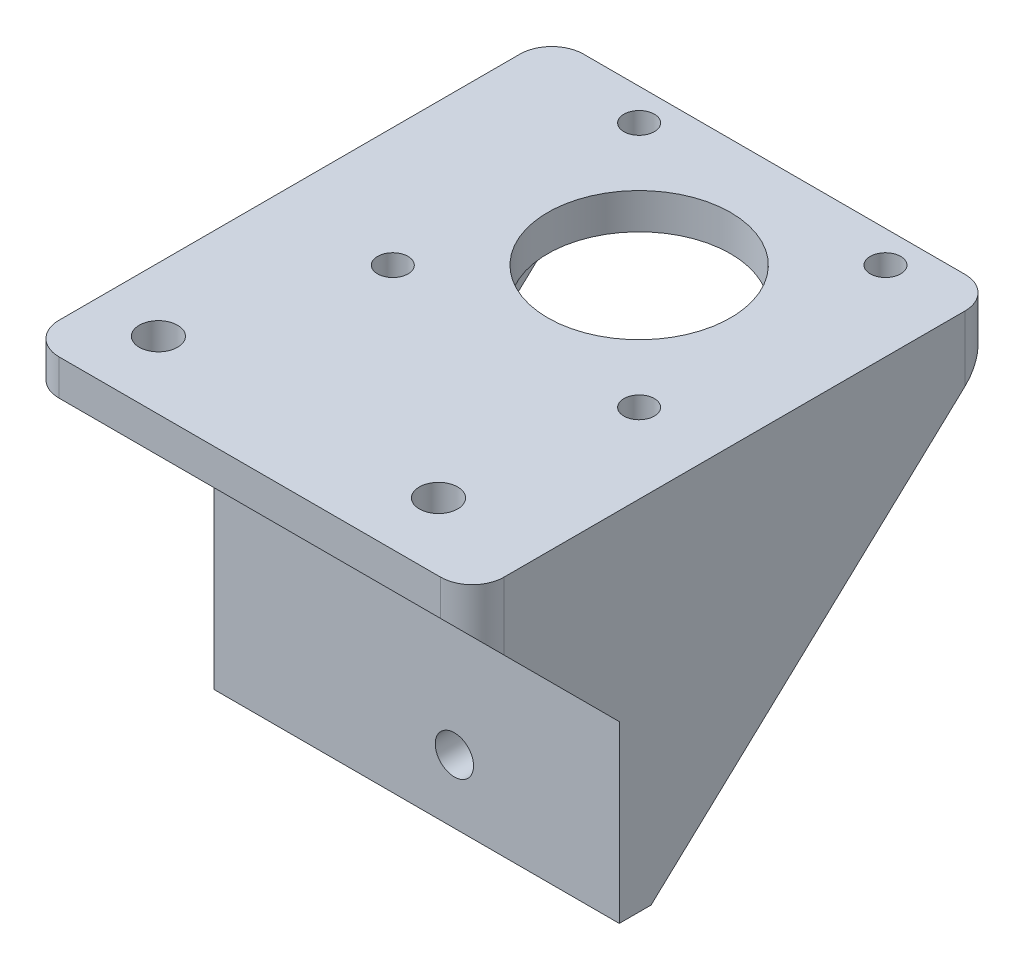
ISO-10303-21;
HEADER;
FILE_DESCRIPTION(('STEP AP214'),'2;1');
FILE_NAME('part.step','',(''),(''),'','','');
FILE_SCHEMA(('AUTOMOTIVE_DESIGN { 1 0 10303 214 1 1 1 1 }'));
ENDSEC;
DATA;
#1=APPLICATION_CONTEXT('core data for automotive mechanical design processes');
#2=APPLICATION_PROTOCOL_DEFINITION('international standard','automotive_design',2000,#1);
#3=PRODUCT_CONTEXT('',#1,'mechanical');
#4=PRODUCT('Part','Part','',(#3));
#5=PRODUCT_RELATED_PRODUCT_CATEGORY('part','',(#4));
#6=PRODUCT_DEFINITION_FORMATION('','',#4);
#7=PRODUCT_DEFINITION_CONTEXT('part definition',#1,'design');
#8=PRODUCT_DEFINITION('design','',#6,#7);
#9=PRODUCT_DEFINITION_SHAPE('','',#8);
#10=(LENGTH_UNIT() NAMED_UNIT(*) SI_UNIT(.MILLI.,.METRE.));
#11=(NAMED_UNIT(*) PLANE_ANGLE_UNIT() SI_UNIT($,.RADIAN.));
#12=(NAMED_UNIT(*) SI_UNIT($,.STERADIAN.) SOLID_ANGLE_UNIT());
#13=UNCERTAINTY_MEASURE_WITH_UNIT(LENGTH_MEASURE(1.E-05),#10,'distance_accuracy_value','');
#14=(GEOMETRIC_REPRESENTATION_CONTEXT(3) GLOBAL_UNCERTAINTY_ASSIGNED_CONTEXT((#13)) GLOBAL_UNIT_ASSIGNED_CONTEXT((#10,
#11,#12)) REPRESENTATION_CONTEXT('',''));
#15=CARTESIAN_POINT('',(0.,0.,0.));
#16=DIRECTION('',(0.,0.,1.));
#17=DIRECTION('',(1.,0.,0.));
#18=AXIS2_PLACEMENT_3D('',#15,#16,#17);
#19=CARTESIAN_POINT('',(-25.5,-40.5,28.));
#20=DIRECTION('',(0.,0.,1.));
#21=DIRECTION('',(1.,0.,0.));
#22=AXIS2_PLACEMENT_3D('',#19,#20,#21);
#23=PLANE('',#22);
#24=DIRECTION('',(-1.,0.,0.));
#25=VECTOR('',#24,1.);
#26=CARTESIAN_POINT('',(55.016944286291,-18.5000000000001,28.));
#27=LINE('',#26,#25);
#28=CARTESIAN_POINT('',(25.5,-18.5000000000001,28.));
#29=VERTEX_POINT('',#28);
#30=CARTESIAN_POINT('',(21.5,-18.5000000000001,28.));
#31=VERTEX_POINT('',#30);
#32=EDGE_CURVE('E182',#29,#31,#27,.T.);
#33=ORIENTED_EDGE('',*,*,#32,.T.);
#34=DIRECTION('',(0.,1.,0.));
#35=VECTOR('',#34,1.);
#36=CARTESIAN_POINT('',(21.5,-40.5,28.));
#37=LINE('',#36,#35);
#38=CARTESIAN_POINT('',(21.5,0.,28.));
#39=VERTEX_POINT('',#38);
#40=EDGE_CURVE('E176',#31,#39,#37,.T.);
#41=ORIENTED_EDGE('',*,*,#40,.T.);
#42=DIRECTION('',(1.,0.,0.));
#43=VECTOR('',#42,1.);
#44=CARTESIAN_POINT('',(-25.5,0.,28.));
#45=LINE('',#44,#43);
#46=CARTESIAN_POINT('',(-25.5,0.,28.));
#47=VERTEX_POINT('',#46);
#48=EDGE_CURVE('E188',#47,#39,#45,.T.);
#49=ORIENTED_EDGE('',*,*,#48,.F.);
#50=DIRECTION('',(0.,1.,0.));
#51=VECTOR('',#50,1.);
#52=CARTESIAN_POINT('',(-25.5,-40.5,28.));
#53=LINE('',#52,#51);
#54=CARTESIAN_POINT('',(-25.5,-40.5,28.));
#55=VERTEX_POINT('',#54);
#56=EDGE_CURVE('E221',#55,#47,#53,.T.);
#57=ORIENTED_EDGE('',*,*,#56,.F.);
#58=DIRECTION('',(1.,0.,0.));
#59=VECTOR('',#58,1.);
#60=CARTESIAN_POINT('',(-25.5,-40.5,28.));
#61=LINE('',#60,#59);
#62=CARTESIAN_POINT('',(25.5,-40.5,28.));
#63=VERTEX_POINT('',#62);
#64=EDGE_CURVE('E275',#55,#63,#61,.T.);
#65=ORIENTED_EDGE('',*,*,#64,.T.);
#66=DIRECTION('',(0.,1.,0.));
#67=VECTOR('',#66,1.);
#68=CARTESIAN_POINT('',(25.5,-40.5,28.));
#69=LINE('',#68,#67);
#70=EDGE_CURVE('E218',#63,#29,#69,.T.);
#71=ORIENTED_EDGE('',*,*,#70,.T.);
#72=EDGE_LOOP('',(#33,#41,#49,#57,#65,#71));
#73=FACE_BOUND('',#72,.T.);
#74=CARTESIAN_POINT('',(4.75,-10.,28.));
#75=DIRECTION('',(0.,0.,1.));
#76=DIRECTION('',(1.,0.,0.));
#77=AXIS2_PLACEMENT_3D('',#74,#75,#76);
#78=CIRCLE('',#77,2.412);
#79=CARTESIAN_POINT('',(7.16200000000001,-10.,28.));
#80=VERTEX_POINT('',#79);
#81=EDGE_CURVE('E269',#80,#80,#78,.T.);
#82=ORIENTED_EDGE('',*,*,#81,.F.);
#83=EDGE_LOOP('',(#82));
#84=FACE_BOUND('',#83,.T.);
#85=CARTESIAN_POINT('',(4.75,-32.5,28.));
#86=DIRECTION('',(0.,0.,1.));
#87=DIRECTION('',(1.,0.,0.));
#88=AXIS2_PLACEMENT_3D('',#85,#86,#87);
#89=CIRCLE('',#88,2.412);
#90=CARTESIAN_POINT('',(7.162,-32.5,28.));
#91=VERTEX_POINT('',#90);
#92=EDGE_CURVE('E374',#91,#91,#89,.T.);
#93=ORIENTED_EDGE('',*,*,#92,.F.);
#94=EDGE_LOOP('',(#93));
#95=FACE_BOUND('',#94,.T.);
#96=ADVANCED_FACE('F38',(#73,#84,#95),#23,.T.);
#97=CARTESIAN_POINT('',(15.5,4.5,-19.5));
#98=DIRECTION('',(0.,0.,1.));
#99=DIRECTION('',(1.,0.,0.));
#100=AXIS2_PLACEMENT_3D('',#97,#98,#99);
#101=PLANE('',#100);
#102=DIRECTION('',(-1.,0.,0.));
#103=VECTOR('',#102,1.);
#104=CARTESIAN_POINT('',(15.5,4.5,-19.5));
#105=LINE('',#104,#103);
#106=CARTESIAN_POINT('',(21.5,4.5,-19.5));
#107=VERTEX_POINT('',#106);
#108=CARTESIAN_POINT('',(-26.5,4.5,-19.5));
#109=VERTEX_POINT('',#108);
#110=EDGE_CURVE('E231',#107,#109,#105,.T.);
#111=ORIENTED_EDGE('',*,*,#110,.F.);
#112=DIRECTION('',(0.,1.,0.));
#113=VECTOR('',#112,1.);
#114=CARTESIAN_POINT('',(21.5,0.,-19.5));
#115=LINE('',#114,#113);
#116=CARTESIAN_POINT('',(21.5,0.,-19.5));
#117=VERTEX_POINT('',#116);
#118=EDGE_CURVE('E47',#107,#117,#115,.F.);
#119=ORIENTED_EDGE('',*,*,#118,.T.);
#120=DIRECTION('',(1.,0.,0.));
#121=VECTOR('',#120,1.);
#122=CARTESIAN_POINT('',(-30.5,0.,-19.5));
#123=LINE('',#122,#121);
#124=CARTESIAN_POINT('',(-25.5,0.,-19.5));
#125=VERTEX_POINT('',#124);
#126=EDGE_CURVE('E404',#125,#117,#123,.T.);
#127=ORIENTED_EDGE('',*,*,#126,.F.);
#128=DIRECTION('',(-1.,0.,0.));
#129=VECTOR('',#128,1.);
#130=CARTESIAN_POINT('',(15.5,0.,-19.5));
#131=LINE('',#130,#129);
#132=CARTESIAN_POINT('',(-26.5,0.,-19.5));
#133=VERTEX_POINT('',#132);
#134=EDGE_CURVE('E166',#125,#133,#131,.T.);
#135=ORIENTED_EDGE('',*,*,#134,.T.);
#136=DIRECTION('',(0.,-1.,0.));
#137=VECTOR('',#136,1.);
#138=CARTESIAN_POINT('',(-26.5,4.5,-19.5));
#139=LINE('',#138,#137);
#140=EDGE_CURVE('E245',#109,#133,#139,.T.);
#141=ORIENTED_EDGE('',*,*,#140,.F.);
#142=EDGE_LOOP('',(#111,#119,#127,#135,#141));
#143=FACE_BOUND('',#142,.T.);
#144=ADVANCED_FACE('F403',(#143),#101,.F.);
#145=CARTESIAN_POINT('',(-26.5,0.,42.5));
#146=DIRECTION('',(0.,-1.,0.));
#147=DIRECTION('',(0.,0.,-1.));
#148=AXIS2_PLACEMENT_3D('',#145,#146,#147);
#149=PLANE('',#148);
#150=ORIENTED_EDGE('',*,*,#48,.T.);
#151=DIRECTION('',(0.,0.,-1.));
#152=VECTOR('',#151,1.);
#153=CARTESIAN_POINT('',(21.5,0.,46.5));
#154=LINE('',#153,#152);
#155=CARTESIAN_POINT('',(21.5,0.,46.5));
#156=VERTEX_POINT('',#155);
#157=EDGE_CURVE('E174',#156,#39,#154,.T.);
#158=ORIENTED_EDGE('',*,*,#157,.F.);
#159=DIRECTION('',(1.,0.,0.));
#160=VECTOR('',#159,1.);
#161=CARTESIAN_POINT('',(15.5,0.,46.5));
#162=LINE('',#161,#160);
#163=CARTESIAN_POINT('',(-26.5,0.,46.5));
#164=VERTEX_POINT('',#163);
#165=EDGE_CURVE('E153',#164,#156,#162,.T.);
#166=ORIENTED_EDGE('',*,*,#165,.F.);
#167=CARTESIAN_POINT('',(-26.5,0.,42.5));
#168=DIRECTION('',(0.,1.,0.));
#169=DIRECTION('',(0.,0.,-1.));
#170=AXIS2_PLACEMENT_3D('',#167,#168,#169);
#171=CIRCLE('',#170,4.);
#172=CARTESIAN_POINT('',(-30.5,0.,42.5));
#173=VERTEX_POINT('',#172);
#174=EDGE_CURVE('E167',#173,#164,#171,.T.);
#175=ORIENTED_EDGE('',*,*,#174,.F.);
#176=DIRECTION('',(0.,0.,1.));
#177=VECTOR('',#176,1.);
#178=CARTESIAN_POINT('',(-30.5,0.,-15.5));
#179=LINE('',#178,#177);
#180=CARTESIAN_POINT('',(-30.5,0.,-15.5));
#181=VERTEX_POINT('',#180);
#182=EDGE_CURVE('E236',#181,#173,#179,.T.);
#183=ORIENTED_EDGE('',*,*,#182,.F.);
#184=CARTESIAN_POINT('',(-26.5,0.,-15.5));
#185=DIRECTION('',(0.,1.,0.));
#186=DIRECTION('',(0.,0.,1.));
#187=AXIS2_PLACEMENT_3D('',#184,#185,#186);
#188=CIRCLE('',#187,4.);
#189=EDGE_CURVE('E234',#133,#181,#188,.T.);
#190=ORIENTED_EDGE('',*,*,#189,.F.);
#191=ORIENTED_EDGE('',*,*,#134,.F.);
#192=DIRECTION('',(0.,0.,1.));
#193=VECTOR('',#192,1.);
#194=CARTESIAN_POINT('',(-25.5,0.,28.));
#195=LINE('',#194,#193);
#196=EDGE_CURVE('E244',#125,#47,#195,.T.);
#197=ORIENTED_EDGE('',*,*,#196,.T.);
#198=EDGE_LOOP('',(#150,#158,#166,#175,#183,#190,#191,#197));
#199=FACE_BOUND('',#198,.T.);
#200=CARTESIAN_POINT('',(12.75,0.,38.));
#201=DIRECTION('',(0.,1.,0.));
#202=DIRECTION('',(0.,0.,1.));
#203=AXIS2_PLACEMENT_3D('',#200,#201,#202);
#204=CIRCLE('',#203,2.41);
#205=CARTESIAN_POINT('',(12.75,0.,40.41));
#206=VERTEX_POINT('',#205);
#207=EDGE_CURVE('E220',#206,#206,#204,.T.);
#208=ORIENTED_EDGE('',*,*,#207,.T.);
#209=EDGE_LOOP('',(#208));
#210=FACE_BOUND('',#209,.T.);
#211=CARTESIAN_POINT('',(-22.5,0.,38.));
#212=DIRECTION('',(0.,1.,0.));
#213=DIRECTION('',(0.,0.,1.));
#214=AXIS2_PLACEMENT_3D('',#211,#212,#213);
#215=CIRCLE('',#214,2.41);
#216=CARTESIAN_POINT('',(-22.5,0.,40.41));
#217=VERTEX_POINT('',#216);
#218=EDGE_CURVE('E250',#217,#217,#215,.T.);
#219=ORIENTED_EDGE('',*,*,#218,.T.);
#220=EDGE_LOOP('',(#219));
#221=FACE_BOUND('',#220,.T.);
#222=ADVANCED_FACE('F184',(#199,#210,#221),#149,.T.);
#223=CARTESIAN_POINT('',(-26.5,4.5,42.5));
#224=DIRECTION('',(0.,-1.,0.));
#225=DIRECTION('',(0.,0.,-1.));
#226=AXIS2_PLACEMENT_3D('',#223,#224,#225);
#227=PLANE('',#226);
#228=DIRECTION('',(1.,0.,0.));
#229=VECTOR('',#228,1.);
#230=CARTESIAN_POINT('',(15.5,4.5,46.5));
#231=LINE('',#230,#229);
#232=CARTESIAN_POINT('',(-26.5,4.5,46.5));
#233=VERTEX_POINT('',#232);
#234=CARTESIAN_POINT('',(21.5,4.5,46.5));
#235=VERTEX_POINT('',#234);
#236=EDGE_CURVE('E229',#233,#235,#231,.T.);
#237=ORIENTED_EDGE('',*,*,#236,.T.);
#238=CARTESIAN_POINT('',(21.5,4.5,42.5));
#239=DIRECTION('',(0.,-1.,0.));
#240=DIRECTION('',(0.,0.,-1.));
#241=AXIS2_PLACEMENT_3D('',#238,#239,#240);
#242=CIRCLE('',#241,4.);
#243=CARTESIAN_POINT('',(25.5,4.5,42.5));
#244=VERTEX_POINT('',#243);
#245=EDGE_CURVE('E203',#235,#244,#242,.F.);
#246=ORIENTED_EDGE('',*,*,#245,.T.);
#247=DIRECTION('',(0.,0.,1.));
#248=VECTOR('',#247,1.);
#249=CARTESIAN_POINT('',(25.5,4.5,-23.));
#250=LINE('',#249,#248);
#251=CARTESIAN_POINT('',(25.5,4.5,-15.5));
#252=VERTEX_POINT('',#251);
#253=EDGE_CURVE('E226',#252,#244,#250,.T.);
#254=ORIENTED_EDGE('',*,*,#253,.F.);
#255=CARTESIAN_POINT('',(21.5,4.5,-15.5));
#256=DIRECTION('',(0.,-1.,0.));
#257=DIRECTION('',(0.,0.,-1.));
#258=AXIS2_PLACEMENT_3D('',#255,#256,#257);
#259=CIRCLE('',#258,4.);
#260=EDGE_CURVE('E61',#252,#107,#259,.F.);
#261=ORIENTED_EDGE('',*,*,#260,.T.);
#262=ORIENTED_EDGE('',*,*,#110,.T.);
#263=CARTESIAN_POINT('',(-26.5,4.5,-15.5));
#264=DIRECTION('',(0.,1.,0.));
#265=DIRECTION('',(0.,0.,1.));
#266=AXIS2_PLACEMENT_3D('',#263,#264,#265);
#267=CIRCLE('',#266,4.);
#268=CARTESIAN_POINT('',(-30.5,4.5,-15.5));
#269=VERTEX_POINT('',#268);
#270=EDGE_CURVE('E347',#109,#269,#267,.T.);
#271=ORIENTED_EDGE('',*,*,#270,.T.);
#272=DIRECTION('',(0.,0.,1.));
#273=VECTOR('',#272,1.);
#274=CARTESIAN_POINT('',(-30.5,4.5,-15.5));
#275=LINE('',#274,#273);
#276=CARTESIAN_POINT('',(-30.5,4.5,42.5));
#277=VERTEX_POINT('',#276);
#278=EDGE_CURVE('E350',#269,#277,#275,.T.);
#279=ORIENTED_EDGE('',*,*,#278,.T.);
#280=CARTESIAN_POINT('',(-26.5,4.5,42.5));
#281=DIRECTION('',(0.,1.,0.));
#282=DIRECTION('',(0.,0.,-1.));
#283=AXIS2_PLACEMENT_3D('',#280,#281,#282);
#284=CIRCLE('',#283,4.);
#285=EDGE_CURVE('E232',#277,#233,#284,.T.);
#286=ORIENTED_EDGE('',*,*,#285,.T.);
#287=EDGE_LOOP('',(#237,#246,#254,#261,#262,#271,#279,#286));
#288=FACE_BOUND('',#287,.T.);
#289=CARTESIAN_POINT('',(0.,4.5,0.));
#290=DIRECTION('',(0.,1.,0.));
#291=DIRECTION('',(0.,0.,1.));
#292=AXIS2_PLACEMENT_3D('',#289,#290,#291);
#293=CIRCLE('',#292,11.5);
#294=CARTESIAN_POINT('',(0.,4.5,11.5));
#295=VERTEX_POINT('',#294);
#296=EDGE_CURVE('E292',#295,#295,#293,.T.);
#297=ORIENTED_EDGE('',*,*,#296,.F.);
#298=EDGE_LOOP('',(#297));
#299=FACE_BOUND('',#298,.T.);
#300=CARTESIAN_POINT('',(15.5,4.5,-15.5));
#301=DIRECTION('',(0.,1.,0.));
#302=DIRECTION('',(0.,0.,1.));
#303=AXIS2_PLACEMENT_3D('',#300,#301,#302);
#304=CIRCLE('',#303,1.91545);
#305=CARTESIAN_POINT('',(15.5,4.5,-13.58455));
#306=VERTEX_POINT('',#305);
#307=EDGE_CURVE('E309',#306,#306,#304,.T.);
#308=ORIENTED_EDGE('',*,*,#307,.F.);
#309=EDGE_LOOP('',(#308));
#310=FACE_BOUND('',#309,.T.);
#311=CARTESIAN_POINT('',(-15.5,4.5,-15.5));
#312=DIRECTION('',(0.,1.,0.));
#313=DIRECTION('',(0.,0.,1.));
#314=AXIS2_PLACEMENT_3D('',#311,#312,#313);
#315=CIRCLE('',#314,1.91545);
#316=CARTESIAN_POINT('',(-15.5,4.5,-13.58455));
#317=VERTEX_POINT('',#316);
#318=EDGE_CURVE('E331',#317,#317,#315,.T.);
#319=ORIENTED_EDGE('',*,*,#318,.F.);
#320=EDGE_LOOP('',(#319));
#321=FACE_BOUND('',#320,.T.);
#322=CARTESIAN_POINT('',(-15.5,4.5,15.5));
#323=DIRECTION('',(0.,1.,0.));
#324=DIRECTION('',(0.,0.,1.));
#325=AXIS2_PLACEMENT_3D('',#322,#323,#324);
#326=CIRCLE('',#325,1.91545);
#327=CARTESIAN_POINT('',(-15.5,4.5,17.41545));
#328=VERTEX_POINT('',#327);
#329=EDGE_CURVE('E263',#328,#328,#326,.T.);
#330=ORIENTED_EDGE('',*,*,#329,.F.);
#331=EDGE_LOOP('',(#330));
#332=FACE_BOUND('',#331,.T.);
#333=CARTESIAN_POINT('',(15.5,4.5,15.5));
#334=DIRECTION('',(0.,1.,0.));
#335=DIRECTION('',(0.,0.,1.));
#336=AXIS2_PLACEMENT_3D('',#333,#334,#335);
#337=CIRCLE('',#336,1.91545);
#338=CARTESIAN_POINT('',(15.5,4.5,17.41545));
#339=VERTEX_POINT('',#338);
#340=EDGE_CURVE('E298',#339,#339,#337,.T.);
#341=ORIENTED_EDGE('',*,*,#340,.F.);
#342=EDGE_LOOP('',(#341));
#343=FACE_BOUND('',#342,.T.);
#344=CARTESIAN_POINT('',(-22.5,4.5,38.));
#345=DIRECTION('',(0.,1.,0.));
#346=DIRECTION('',(0.,0.,1.));
#347=AXIS2_PLACEMENT_3D('',#344,#345,#346);
#348=CIRCLE('',#347,2.41);
#349=CARTESIAN_POINT('',(-22.5,4.5,40.41));
#350=VERTEX_POINT('',#349);
#351=EDGE_CURVE('E247',#350,#350,#348,.T.);
#352=ORIENTED_EDGE('',*,*,#351,.F.);
#353=EDGE_LOOP('',(#352));
#354=FACE_BOUND('',#353,.T.);
#355=CARTESIAN_POINT('',(12.75,4.5,38.));
#356=DIRECTION('',(0.,1.,0.));
#357=DIRECTION('',(0.,0.,1.));
#358=AXIS2_PLACEMENT_3D('',#355,#356,#357);
#359=CIRCLE('',#358,2.41);
#360=CARTESIAN_POINT('',(12.75,4.5,40.41));
#361=VERTEX_POINT('',#360);
#362=EDGE_CURVE('E288',#361,#361,#359,.T.);
#363=ORIENTED_EDGE('',*,*,#362,.F.);
#364=EDGE_LOOP('',(#363));
#365=FACE_BOUND('',#364,.T.);
#366=ADVANCED_FACE('F386',(#288,#299,#310,#321,#332,#343,#354,#365),#227,.F.);
#367=DIRECTION('',(-1.,0.,0.));
#368=VECTOR('',#367,1.);
#369=CARTESIAN_POINT('',(-21.5,0.,-19.));
#370=LINE('',#369,#368);
#371=CARTESIAN_POINT('',(21.5,0.,-19.));
#372=VERTEX_POINT('',#371);
#373=CARTESIAN_POINT('',(-21.5,0.,-19.));
#374=VERTEX_POINT('',#373);
#375=EDGE_CURVE('E369',#372,#374,#370,.T.);
#376=ORIENTED_EDGE('',*,*,#375,.F.);
#377=DIRECTION('',(0.,0.,-1.));
#378=VECTOR('',#377,1.);
#379=CARTESIAN_POINT('',(21.5,0.,24.));
#380=LINE('',#379,#378);
#381=CARTESIAN_POINT('',(21.5,0.,24.));
#382=VERTEX_POINT('',#381);
#383=EDGE_CURVE('E283',#382,#372,#380,.T.);
#384=ORIENTED_EDGE('',*,*,#383,.F.);
#385=DIRECTION('',(1.,0.,0.));
#386=VECTOR('',#385,1.);
#387=CARTESIAN_POINT('',(-21.5,0.,24.));
#388=LINE('',#387,#386);
#389=CARTESIAN_POINT('',(-21.5,0.,24.));
#390=VERTEX_POINT('',#389);
#391=EDGE_CURVE('E282',#390,#382,#388,.T.);
#392=ORIENTED_EDGE('',*,*,#391,.F.);
#393=DIRECTION('',(0.,0.,1.));
#394=VECTOR('',#393,1.);
#395=CARTESIAN_POINT('',(-21.5,0.,24.));
#396=LINE('',#395,#394);
#397=EDGE_CURVE('E279',#374,#390,#396,.T.);
#398=ORIENTED_EDGE('',*,*,#397,.F.);
#399=EDGE_LOOP('',(#376,#384,#392,#398));
#400=FACE_BOUND('',#399,.T.);
#401=CARTESIAN_POINT('',(-15.5,0.,15.5));
#402=DIRECTION('',(0.,1.,0.));
#403=DIRECTION('',(0.,0.,1.));
#404=AXIS2_PLACEMENT_3D('',#401,#402,#403);
#405=CIRCLE('',#404,1.91545);
#406=CARTESIAN_POINT('',(-15.5,0.,17.41545));
#407=VERTEX_POINT('',#406);
#408=EDGE_CURVE('E267',#407,#407,#405,.T.);
#409=ORIENTED_EDGE('',*,*,#408,.T.);
#410=EDGE_LOOP('',(#409));
#411=FACE_BOUND('',#410,.T.);
#412=CARTESIAN_POINT('',(15.5,0.,-15.5));
#413=DIRECTION('',(0.,1.,0.));
#414=DIRECTION('',(0.,0.,1.));
#415=AXIS2_PLACEMENT_3D('',#412,#413,#414);
#416=CIRCLE('',#415,1.91545);
#417=CARTESIAN_POINT('',(15.5,0.,-13.58455));
#418=VERTEX_POINT('',#417);
#419=EDGE_CURVE('E312',#418,#418,#416,.T.);
#420=ORIENTED_EDGE('',*,*,#419,.T.);
#421=EDGE_LOOP('',(#420));
#422=FACE_BOUND('',#421,.T.);
#423=CARTESIAN_POINT('',(0.,0.,0.));
#424=DIRECTION('',(0.,1.,0.));
#425=DIRECTION('',(0.,0.,1.));
#426=AXIS2_PLACEMENT_3D('',#423,#424,#425);
#427=CIRCLE('',#426,11.5);
#428=CARTESIAN_POINT('',(0.,0.,11.5));
#429=VERTEX_POINT('',#428);
#430=EDGE_CURVE('E216',#429,#429,#427,.T.);
#431=ORIENTED_EDGE('',*,*,#430,.T.);
#432=EDGE_LOOP('',(#431));
#433=FACE_BOUND('',#432,.T.);
#434=CARTESIAN_POINT('',(-15.5,0.,-15.5));
#435=DIRECTION('',(0.,1.,0.));
#436=DIRECTION('',(0.,0.,1.));
#437=AXIS2_PLACEMENT_3D('',#434,#435,#436);
#438=CIRCLE('',#437,1.91545);
#439=CARTESIAN_POINT('',(-15.5,0.,-13.58455));
#440=VERTEX_POINT('',#439);
#441=EDGE_CURVE('E266',#440,#440,#438,.T.);
#442=ORIENTED_EDGE('',*,*,#441,.T.);
#443=EDGE_LOOP('',(#442));
#444=FACE_BOUND('',#443,.T.);
#445=CARTESIAN_POINT('',(15.5,0.,15.5));
#446=DIRECTION('',(0.,1.,0.));
#447=DIRECTION('',(0.,0.,1.));
#448=AXIS2_PLACEMENT_3D('',#445,#446,#447);
#449=CIRCLE('',#448,1.91545);
#450=CARTESIAN_POINT('',(15.5,0.,17.41545));
#451=VERTEX_POINT('',#450);
#452=EDGE_CURVE('E249',#451,#451,#449,.T.);
#453=ORIENTED_EDGE('',*,*,#452,.T.);
#454=EDGE_LOOP('',(#453));
#455=FACE_BOUND('',#454,.T.);
#456=ADVANCED_FACE('F524',(#400,#411,#422,#433,#444,#455),#149,.T.);
#457=CARTESIAN_POINT('',(-26.5,4.5,42.5));
#458=DIRECTION('',(0.,-1.,0.));
#459=DIRECTION('',(0.,0.,-1.));
#460=AXIS2_PLACEMENT_3D('',#457,#458,#459);
#461=CYLINDRICAL_SURFACE('',#460,4.);
#462=ORIENTED_EDGE('',*,*,#174,.T.);
#463=DIRECTION('',(0.,-1.,0.));
#464=VECTOR('',#463,1.);
#465=CARTESIAN_POINT('',(-26.5,4.5,46.5));
#466=LINE('',#465,#464);
#467=EDGE_CURVE('E160',#233,#164,#466,.T.);
#468=ORIENTED_EDGE('',*,*,#467,.F.);
#469=ORIENTED_EDGE('',*,*,#285,.F.);
#470=DIRECTION('',(0.,-1.,0.));
#471=VECTOR('',#470,1.);
#472=CARTESIAN_POINT('',(-30.5,4.5,42.5));
#473=LINE('',#472,#471);
#474=EDGE_CURVE('E261',#277,#173,#473,.T.);
#475=ORIENTED_EDGE('',*,*,#474,.T.);
#476=EDGE_LOOP('',(#462,#468,#469,#475));
#477=FACE_BOUND('',#476,.T.);
#478=ADVANCED_FACE('F392',(#477),#461,.T.);
#479=CARTESIAN_POINT('',(15.5,4.5,46.5));
#480=DIRECTION('',(0.,0.,-1.));
#481=DIRECTION('',(-1.,0.,0.));
#482=AXIS2_PLACEMENT_3D('',#479,#480,#481);
#483=PLANE('',#482);
#484=ORIENTED_EDGE('',*,*,#165,.T.);
#485=DIRECTION('',(0.,-1.,0.));
#486=VECTOR('',#485,1.);
#487=CARTESIAN_POINT('',(21.5,4.5,46.5));
#488=LINE('',#487,#486);
#489=EDGE_CURVE('E157',#156,#235,#488,.F.);
#490=ORIENTED_EDGE('',*,*,#489,.T.);
#491=ORIENTED_EDGE('',*,*,#236,.F.);
#492=ORIENTED_EDGE('',*,*,#467,.T.);
#493=EDGE_LOOP('',(#484,#490,#491,#492));
#494=FACE_BOUND('',#493,.T.);
#495=ADVANCED_FACE('F155',(#494),#483,.F.);
#496=CARTESIAN_POINT('',(-26.5,4.5,-15.5));
#497=DIRECTION('',(0.,-1.,0.));
#498=DIRECTION('',(0.,0.,-1.));
#499=AXIS2_PLACEMENT_3D('',#496,#497,#498);
#500=CYLINDRICAL_SURFACE('',#499,4.);
#501=ORIENTED_EDGE('',*,*,#189,.T.);
#502=DIRECTION('',(0.,-1.,0.));
#503=VECTOR('',#502,1.);
#504=CARTESIAN_POINT('',(-30.5,4.5,-15.5));
#505=LINE('',#504,#503);
#506=EDGE_CURVE('E258',#269,#181,#505,.T.);
#507=ORIENTED_EDGE('',*,*,#506,.F.);
#508=ORIENTED_EDGE('',*,*,#270,.F.);
#509=ORIENTED_EDGE('',*,*,#140,.T.);
#510=EDGE_LOOP('',(#501,#507,#508,#509));
#511=FACE_BOUND('',#510,.T.);
#512=ADVANCED_FACE('F401',(#511),#500,.T.);
#513=CARTESIAN_POINT('',(-30.5,4.5,-15.5));
#514=DIRECTION('',(1.,0.,0.));
#515=DIRECTION('',(0.,0.,-1.));
#516=AXIS2_PLACEMENT_3D('',#513,#514,#515);
#517=PLANE('',#516);
#518=ORIENTED_EDGE('',*,*,#182,.T.);
#519=ORIENTED_EDGE('',*,*,#474,.F.);
#520=ORIENTED_EDGE('',*,*,#278,.F.);
#521=ORIENTED_EDGE('',*,*,#506,.T.);
#522=EDGE_LOOP('',(#518,#519,#520,#521));
#523=FACE_BOUND('',#522,.T.);
#524=ADVANCED_FACE('F397',(#523),#517,.F.);
#525=CARTESIAN_POINT('',(0.,4.5,0.));
#526=DIRECTION('',(0.,-1.,0.));
#527=DIRECTION('',(0.,0.,-1.));
#528=AXIS2_PLACEMENT_3D('',#525,#526,#527);
#529=CYLINDRICAL_SURFACE('',#528,11.5);
#530=ORIENTED_EDGE('',*,*,#296,.T.);
#531=EDGE_LOOP('',(#530));
#532=FACE_BOUND('',#531,.T.);
#533=ORIENTED_EDGE('',*,*,#430,.F.);
#534=EDGE_LOOP('',(#533));
#535=FACE_BOUND('',#534,.T.);
#536=ADVANCED_FACE('F517',(#532,#535),#529,.F.);
#537=CARTESIAN_POINT('',(15.5,4.5,-15.5));
#538=DIRECTION('',(0.,-1.,0.));
#539=DIRECTION('',(0.,0.,-1.));
#540=AXIS2_PLACEMENT_3D('',#537,#538,#539);
#541=CYLINDRICAL_SURFACE('',#540,1.91545);
#542=ORIENTED_EDGE('',*,*,#307,.T.);
#543=EDGE_LOOP('',(#542));
#544=FACE_BOUND('',#543,.T.);
#545=ORIENTED_EDGE('',*,*,#419,.F.);
#546=EDGE_LOOP('',(#545));
#547=FACE_BOUND('',#546,.T.);
#548=ADVANCED_FACE('F513',(#544,#547),#541,.F.);
#549=CARTESIAN_POINT('',(-15.5,4.5,-15.5));
#550=DIRECTION('',(0.,-1.,0.));
#551=DIRECTION('',(0.,0.,-1.));
#552=AXIS2_PLACEMENT_3D('',#549,#550,#551);
#553=CYLINDRICAL_SURFACE('',#552,1.91545);
#554=ORIENTED_EDGE('',*,*,#318,.T.);
#555=EDGE_LOOP('',(#554));
#556=FACE_BOUND('',#555,.T.);
#557=ORIENTED_EDGE('',*,*,#441,.F.);
#558=EDGE_LOOP('',(#557));
#559=FACE_BOUND('',#558,.T.);
#560=ADVANCED_FACE('F509',(#556,#559),#553,.F.);
#561=CARTESIAN_POINT('',(-15.5,4.5,15.5));
#562=DIRECTION('',(0.,-1.,0.));
#563=DIRECTION('',(0.,0.,-1.));
#564=AXIS2_PLACEMENT_3D('',#561,#562,#563);
#565=CYLINDRICAL_SURFACE('',#564,1.91545);
#566=ORIENTED_EDGE('',*,*,#329,.T.);
#567=EDGE_LOOP('',(#566));
#568=FACE_BOUND('',#567,.T.);
#569=ORIENTED_EDGE('',*,*,#408,.F.);
#570=EDGE_LOOP('',(#569));
#571=FACE_BOUND('',#570,.T.);
#572=ADVANCED_FACE('F505',(#568,#571),#565,.F.);
#573=CARTESIAN_POINT('',(15.5,4.5,15.5));
#574=DIRECTION('',(0.,-1.,0.));
#575=DIRECTION('',(0.,0.,-1.));
#576=AXIS2_PLACEMENT_3D('',#573,#574,#575);
#577=CYLINDRICAL_SURFACE('',#576,1.91545);
#578=ORIENTED_EDGE('',*,*,#340,.T.);
#579=EDGE_LOOP('',(#578));
#580=FACE_BOUND('',#579,.T.);
#581=ORIENTED_EDGE('',*,*,#452,.F.);
#582=EDGE_LOOP('',(#581));
#583=FACE_BOUND('',#582,.T.);
#584=ADVANCED_FACE('F501',(#580,#583),#577,.F.);
#585=CARTESIAN_POINT('',(-22.5,4.5,38.));
#586=DIRECTION('',(0.,-1.,0.));
#587=DIRECTION('',(0.,0.,-1.));
#588=AXIS2_PLACEMENT_3D('',#585,#586,#587);
#589=CYLINDRICAL_SURFACE('',#588,2.41);
#590=ORIENTED_EDGE('',*,*,#351,.T.);
#591=EDGE_LOOP('',(#590));
#592=FACE_BOUND('',#591,.T.);
#593=ORIENTED_EDGE('',*,*,#218,.F.);
#594=EDGE_LOOP('',(#593));
#595=FACE_BOUND('',#594,.T.);
#596=ADVANCED_FACE('F497',(#592,#595),#589,.F.);
#597=CARTESIAN_POINT('',(12.75,4.5,38.));
#598=DIRECTION('',(0.,-1.,0.));
#599=DIRECTION('',(0.,0.,-1.));
#600=AXIS2_PLACEMENT_3D('',#597,#598,#599);
#601=CYLINDRICAL_SURFACE('',#600,2.41);
#602=ORIENTED_EDGE('',*,*,#362,.T.);
#603=EDGE_LOOP('',(#602));
#604=FACE_BOUND('',#603,.T.);
#605=ORIENTED_EDGE('',*,*,#207,.F.);
#606=EDGE_LOOP('',(#605));
#607=FACE_BOUND('',#606,.T.);
#608=ADVANCED_FACE('F494',(#604,#607),#601,.F.);
#609=CARTESIAN_POINT('',(25.5,-40.5,28.));
#610=DIRECTION('',(1.,0.,0.));
#611=DIRECTION('',(0.,0.,-1.));
#612=AXIS2_PLACEMENT_3D('',#609,#610,#611);
#613=PLANE('',#612);
#614=ORIENTED_EDGE('',*,*,#253,.T.);
#615=DIRECTION('',(0.,-1.,0.));
#616=VECTOR('',#615,1.);
#617=CARTESIAN_POINT('',(25.5,0.,42.5));
#618=LINE('',#617,#616);
#619=CARTESIAN_POINT('',(25.5,-3.99999999999999,42.5));
#620=VERTEX_POINT('',#619);
#621=EDGE_CURVE('E199',#244,#620,#618,.T.);
#622=ORIENTED_EDGE('',*,*,#621,.T.);
#623=DIRECTION('',(0.,-0.707106781186549,-0.707106781186546));
#624=VECTOR('',#623,1.);
#625=CARTESIAN_POINT('',(25.5,-18.5000000000001,28.));
#626=LINE('',#625,#624);
#627=EDGE_CURVE('E194',#620,#29,#626,.T.);
#628=ORIENTED_EDGE('',*,*,#627,.T.);
#629=ORIENTED_EDGE('',*,*,#70,.F.);
#630=DIRECTION('',(0.,0.,-1.));
#631=VECTOR('',#630,1.);
#632=CARTESIAN_POINT('',(25.5,-40.5,28.));
#633=LINE('',#632,#631);
#634=CARTESIAN_POINT('',(25.5,-40.5,24.));
#635=VERTEX_POINT('',#634);
#636=EDGE_CURVE('E314',#63,#635,#633,.T.);
#637=ORIENTED_EDGE('',*,*,#636,.T.);
#638=DIRECTION('',(0.,-0.681418527918843,0.73189397443135));
#639=VECTOR('',#638,1.);
#640=CARTESIAN_POINT('',(25.5,0.,-19.5));
#641=LINE('',#640,#639);
#642=CARTESIAN_POINT('',(25.5,-3.72413793103448,-15.5));
#643=VERTEX_POINT('',#642);
#644=EDGE_CURVE('E272',#643,#635,#641,.T.);
#645=ORIENTED_EDGE('',*,*,#644,.F.);
#646=DIRECTION('',(0.,1.,0.));
#647=VECTOR('',#646,1.);
#648=CARTESIAN_POINT('',(25.5,4.5,-15.5));
#649=LINE('',#648,#647);
#650=EDGE_CURVE('E368',#643,#252,#649,.T.);
#651=ORIENTED_EDGE('',*,*,#650,.T.);
#652=EDGE_LOOP('',(#614,#622,#628,#629,#637,#645,#651));
#653=FACE_BOUND('',#652,.T.);
#654=ADVANCED_FACE('F382',(#653),#613,.T.);
#655=CARTESIAN_POINT('',(-25.5,-40.5,28.));
#656=DIRECTION('',(-1.,0.,0.));
#657=DIRECTION('',(0.,0.,1.));
#658=AXIS2_PLACEMENT_3D('',#655,#656,#657);
#659=PLANE('',#658);
#660=DIRECTION('',(0.,0.681418527918843,-0.73189397443135));
#661=VECTOR('',#660,1.);
#662=CARTESIAN_POINT('',(-25.5,-42.4949044585987,26.1426751592357));
#663=LINE('',#662,#661);
#664=CARTESIAN_POINT('',(-25.5,-40.5,24.));
#665=VERTEX_POINT('',#664);
#666=EDGE_CURVE('E224',#665,#125,#663,.T.);
#667=ORIENTED_EDGE('',*,*,#666,.F.);
#668=DIRECTION('',(0.,0.,1.));
#669=VECTOR('',#668,1.);
#670=CARTESIAN_POINT('',(-25.5,-40.5,28.));
#671=LINE('',#670,#669);
#672=EDGE_CURVE('E277',#665,#55,#671,.T.);
#673=ORIENTED_EDGE('',*,*,#672,.T.);
#674=ORIENTED_EDGE('',*,*,#56,.T.);
#675=ORIENTED_EDGE('',*,*,#196,.F.);
#676=EDGE_LOOP('',(#667,#673,#674,#675));
#677=FACE_BOUND('',#676,.T.);
#678=ADVANCED_FACE('F432',(#677),#659,.T.);
#679=CARTESIAN_POINT('',(0.,-40.5,0.));
#680=DIRECTION('',(0.,-1.,0.));
#681=DIRECTION('',(0.,0.,-1.));
#682=AXIS2_PLACEMENT_3D('',#679,#680,#681);
#683=PLANE('',#682);
#684=DIRECTION('',(1.,0.,0.));
#685=VECTOR('',#684,1.);
#686=CARTESIAN_POINT('',(-30.5,-40.5,24.));
#687=LINE('',#686,#685);
#688=CARTESIAN_POINT('',(21.5,-40.5,24.));
#689=VERTEX_POINT('',#688);
#690=EDGE_CURVE('E442',#689,#635,#687,.T.);
#691=ORIENTED_EDGE('',*,*,#690,.T.);
#692=ORIENTED_EDGE('',*,*,#636,.F.);
#693=ORIENTED_EDGE('',*,*,#64,.F.);
#694=ORIENTED_EDGE('',*,*,#672,.F.);
#695=CARTESIAN_POINT('',(-21.5,-40.5,24.));
#696=VERTEX_POINT('',#695);
#697=EDGE_CURVE('E241',#665,#696,#687,.T.);
#698=ORIENTED_EDGE('',*,*,#697,.T.);
#699=DIRECTION('',(1.,0.,0.));
#700=VECTOR('',#699,1.);
#701=CARTESIAN_POINT('',(-21.5,-40.5,24.));
#702=LINE('',#701,#700);
#703=EDGE_CURVE('E421',#696,#689,#702,.T.);
#704=ORIENTED_EDGE('',*,*,#703,.T.);
#705=EDGE_LOOP('',(#691,#692,#693,#694,#698,#704));
#706=FACE_BOUND('',#705,.T.);
#707=ADVANCED_FACE('F440',(#706),#683,.T.);
#708=CARTESIAN_POINT('',(21.5,-40.5,24.));
#709=DIRECTION('',(1.,0.,0.));
#710=DIRECTION('',(0.,0.,-1.));
#711=AXIS2_PLACEMENT_3D('',#708,#709,#710);
#712=PLANE('',#711);
#713=DIRECTION('',(0.,1.,0.));
#714=VECTOR('',#713,1.);
#715=CARTESIAN_POINT('',(21.5,-40.5,-19.));
#716=LINE('',#715,#714);
#717=CARTESIAN_POINT('',(21.5,-0.465517241379311,-19.));
#718=VERTEX_POINT('',#717);
#719=EDGE_CURVE('E425',#718,#372,#716,.T.);
#720=ORIENTED_EDGE('',*,*,#719,.F.);
#721=DIRECTION('',(0.,-0.681418527918843,0.73189397443135));
#722=VECTOR('',#721,1.);
#723=CARTESIAN_POINT('',(21.5,-40.5,24.));
#724=LINE('',#723,#722);
#725=EDGE_CURVE('E227',#718,#689,#724,.T.);
#726=ORIENTED_EDGE('',*,*,#725,.T.);
#727=DIRECTION('',(0.,1.,0.));
#728=VECTOR('',#727,1.);
#729=CARTESIAN_POINT('',(21.5,-40.5,24.));
#730=LINE('',#729,#728);
#731=EDGE_CURVE('E255',#689,#382,#730,.T.);
#732=ORIENTED_EDGE('',*,*,#731,.T.);
#733=ORIENTED_EDGE('',*,*,#383,.T.);
#734=EDGE_LOOP('',(#720,#726,#732,#733));
#735=FACE_BOUND('',#734,.T.);
#736=ADVANCED_FACE('F466',(#735),#712,.F.);
#737=CARTESIAN_POINT('',(-21.5,-40.5,24.));
#738=DIRECTION('',(0.,0.,1.));
#739=DIRECTION('',(1.,0.,0.));
#740=AXIS2_PLACEMENT_3D('',#737,#738,#739);
#741=PLANE('',#740);
#742=CARTESIAN_POINT('',(4.75,-10.,24.));
#743=DIRECTION('',(0.,0.,1.));
#744=DIRECTION('',(1.,0.,0.));
#745=AXIS2_PLACEMENT_3D('',#742,#743,#744);
#746=CIRCLE('',#745,2.412);
#747=CARTESIAN_POINT('',(7.16200000000001,-10.,24.));
#748=VERTEX_POINT('',#747);
#749=EDGE_CURVE('E273',#748,#748,#746,.T.);
#750=ORIENTED_EDGE('',*,*,#749,.T.);
#751=EDGE_LOOP('',(#750));
#752=FACE_BOUND('',#751,.T.);
#753=CARTESIAN_POINT('',(4.75,-32.5,24.));
#754=DIRECTION('',(0.,0.,1.));
#755=DIRECTION('',(1.,0.,0.));
#756=AXIS2_PLACEMENT_3D('',#753,#754,#755);
#757=CIRCLE('',#756,2.412);
#758=CARTESIAN_POINT('',(7.162,-32.5,24.));
#759=VERTEX_POINT('',#758);
#760=EDGE_CURVE('E370',#759,#759,#757,.T.);
#761=ORIENTED_EDGE('',*,*,#760,.T.);
#762=EDGE_LOOP('',(#761));
#763=FACE_BOUND('',#762,.T.);
#764=ORIENTED_EDGE('',*,*,#391,.T.);
#765=ORIENTED_EDGE('',*,*,#731,.F.);
#766=ORIENTED_EDGE('',*,*,#703,.F.);
#767=DIRECTION('',(0.,1.,0.));
#768=VECTOR('',#767,1.);
#769=CARTESIAN_POINT('',(-21.5,-40.5,24.));
#770=LINE('',#769,#768);
#771=EDGE_CURVE('E253',#696,#390,#770,.T.);
#772=ORIENTED_EDGE('',*,*,#771,.T.);
#773=EDGE_LOOP('',(#764,#765,#766,#772));
#774=FACE_BOUND('',#773,.T.);
#775=ADVANCED_FACE('F461',(#752,#763,#774),#741,.F.);
#776=CARTESIAN_POINT('',(-21.5,-40.5,24.));
#777=DIRECTION('',(-1.,0.,0.));
#778=DIRECTION('',(0.,0.,1.));
#779=AXIS2_PLACEMENT_3D('',#776,#777,#778);
#780=PLANE('',#779);
#781=ORIENTED_EDGE('',*,*,#771,.F.);
#782=DIRECTION('',(0.,0.681418527918843,-0.73189397443135));
#783=VECTOR('',#782,1.);
#784=CARTESIAN_POINT('',(-21.5,-40.5,24.));
#785=LINE('',#784,#783);
#786=CARTESIAN_POINT('',(-21.5,-0.465517241379311,-19.));
#787=VERTEX_POINT('',#786);
#788=EDGE_CURVE('E238',#696,#787,#785,.T.);
#789=ORIENTED_EDGE('',*,*,#788,.T.);
#790=DIRECTION('',(0.,1.,0.));
#791=VECTOR('',#790,1.);
#792=CARTESIAN_POINT('',(-21.5,-40.5,-19.));
#793=LINE('',#792,#791);
#794=EDGE_CURVE('E256',#787,#374,#793,.T.);
#795=ORIENTED_EDGE('',*,*,#794,.T.);
#796=ORIENTED_EDGE('',*,*,#397,.T.);
#797=EDGE_LOOP('',(#781,#789,#795,#796));
#798=FACE_BOUND('',#797,.T.);
#799=ADVANCED_FACE('F471',(#798),#780,.F.);
#800=CARTESIAN_POINT('',(-21.5,-40.5,-19.));
#801=DIRECTION('',(0.,0.,-1.));
#802=DIRECTION('',(-1.,0.,0.));
#803=AXIS2_PLACEMENT_3D('',#800,#801,#802);
#804=PLANE('',#803);
#805=ORIENTED_EDGE('',*,*,#794,.F.);
#806=DIRECTION('',(1.,0.,0.));
#807=VECTOR('',#806,1.);
#808=CARTESIAN_POINT('',(-21.5,-0.465517241379311,-19.));
#809=LINE('',#808,#807);
#810=EDGE_CURVE('E364',#787,#718,#809,.T.);
#811=ORIENTED_EDGE('',*,*,#810,.T.);
#812=ORIENTED_EDGE('',*,*,#719,.T.);
#813=ORIENTED_EDGE('',*,*,#375,.T.);
#814=EDGE_LOOP('',(#805,#811,#812,#813));
#815=FACE_BOUND('',#814,.T.);
#816=ADVANCED_FACE('F469',(#815),#804,.F.);
#817=CARTESIAN_POINT('',(-30.5,0.,-19.5));
#818=DIRECTION('',(0.,0.73189397443135,0.681418527918843));
#819=DIRECTION('',(0.,-0.681418527918843,0.73189397443135));
#820=AXIS2_PLACEMENT_3D('',#817,#818,#819);
#821=PLANE('',#820);
#822=ORIENTED_EDGE('',*,*,#126,.T.);
#823=CARTESIAN_POINT('',(21.5,-3.72413793103448,-15.5));
#824=DIRECTION('',(0.,0.73189397443135,0.681418527918843));
#825=DIRECTION('',(0.,-0.681418527918843,0.73189397443135));
#826=AXIS2_PLACEMENT_3D('',#823,#824,#825);
#827=ELLIPSE('',#826,5.46527248445764,4.);
#828=EDGE_CURVE('E11',#117,#643,#827,.F.);
#829=ORIENTED_EDGE('',*,*,#828,.T.);
#830=ORIENTED_EDGE('',*,*,#644,.T.);
#831=ORIENTED_EDGE('',*,*,#690,.F.);
#832=ORIENTED_EDGE('',*,*,#725,.F.);
#833=ORIENTED_EDGE('',*,*,#810,.F.);
#834=ORIENTED_EDGE('',*,*,#788,.F.);
#835=ORIENTED_EDGE('',*,*,#697,.F.);
#836=ORIENTED_EDGE('',*,*,#666,.T.);
#837=EDGE_LOOP('',(#822,#829,#830,#831,#832,#833,#834,#835,#836));
#838=FACE_BOUND('',#837,.T.);
#839=ADVANCED_FACE('F468',(#838),#821,.F.);
#840=CARTESIAN_POINT('',(4.75,-32.5,-19.5));
#841=DIRECTION('',(0.,0.,1.));
#842=DIRECTION('',(1.,0.,0.));
#843=AXIS2_PLACEMENT_3D('',#840,#841,#842);
#844=CYLINDRICAL_SURFACE('',#843,2.412);
#845=ORIENTED_EDGE('',*,*,#92,.T.);
#846=EDGE_LOOP('',(#845));
#847=FACE_BOUND('',#846,.T.);
#848=ORIENTED_EDGE('',*,*,#760,.F.);
#849=EDGE_LOOP('',(#848));
#850=FACE_BOUND('',#849,.T.);
#851=ADVANCED_FACE('F604',(#847,#850),#844,.F.);
#852=CARTESIAN_POINT('',(4.75,-10.,-19.5));
#853=DIRECTION('',(0.,0.,1.));
#854=DIRECTION('',(1.,0.,0.));
#855=AXIS2_PLACEMENT_3D('',#852,#853,#854);
#856=CYLINDRICAL_SURFACE('',#855,2.412);
#857=ORIENTED_EDGE('',*,*,#81,.T.);
#858=EDGE_LOOP('',(#857));
#859=FACE_BOUND('',#858,.T.);
#860=ORIENTED_EDGE('',*,*,#749,.F.);
#861=EDGE_LOOP('',(#860));
#862=FACE_BOUND('',#861,.T.);
#863=ADVANCED_FACE('F610',(#859,#862),#856,.F.);
#864=CARTESIAN_POINT('',(55.016944286291,-18.5000000000001,28.));
#865=DIRECTION('',(0.,0.707106781186546,-0.707106781186549));
#866=DIRECTION('',(0.,0.707106781186549,0.707106781186546));
#867=AXIS2_PLACEMENT_3D('',#864,#865,#866);
#868=PLANE('',#867);
#869=CARTESIAN_POINT('',(21.5,-4.,42.5));
#870=DIRECTION('',(0.,0.707106781186546,-0.707106781186549));
#871=DIRECTION('',(0.,0.707106781186549,0.707106781186546));
#872=AXIS2_PLACEMENT_3D('',#869,#870,#871);
#873=ELLIPSE('',#872,5.65685424949239,4.);
#874=EDGE_CURVE('E192',#620,#156,#873,.F.);
#875=ORIENTED_EDGE('',*,*,#874,.T.);
#876=DIRECTION('',(0.,-0.707106781186549,-0.707106781186546));
#877=VECTOR('',#876,1.);
#878=CARTESIAN_POINT('',(21.5,-18.5000000000001,28.));
#879=LINE('',#878,#877);
#880=EDGE_CURVE('E172',#156,#31,#879,.T.);
#881=ORIENTED_EDGE('',*,*,#880,.T.);
#882=ORIENTED_EDGE('',*,*,#32,.F.);
#883=ORIENTED_EDGE('',*,*,#627,.F.);
#884=EDGE_LOOP('',(#875,#881,#882,#883));
#885=FACE_BOUND('',#884,.T.);
#886=ADVANCED_FACE('F193',(#885),#868,.F.);
#887=CARTESIAN_POINT('',(21.5,-40.5,42.5));
#888=DIRECTION('',(0.,1.,0.));
#889=DIRECTION('',(0.,0.,1.));
#890=AXIS2_PLACEMENT_3D('',#887,#888,#889);
#891=CYLINDRICAL_SURFACE('',#890,4.);
#892=ORIENTED_EDGE('',*,*,#245,.F.);
#893=ORIENTED_EDGE('',*,*,#489,.F.);
#894=ORIENTED_EDGE('',*,*,#874,.F.);
#895=ORIENTED_EDGE('',*,*,#621,.F.);
#896=EDGE_LOOP('',(#892,#893,#894,#895));
#897=FACE_BOUND('',#896,.T.);
#898=ADVANCED_FACE('F202',(#897),#891,.T.);
#899=CARTESIAN_POINT('',(21.5,-40.5,-15.5));
#900=DIRECTION('',(0.,-1.,0.));
#901=DIRECTION('',(0.,0.,-1.));
#902=AXIS2_PLACEMENT_3D('',#899,#900,#901);
#903=CYLINDRICAL_SURFACE('',#902,4.);
#904=ORIENTED_EDGE('',*,*,#828,.F.);
#905=ORIENTED_EDGE('',*,*,#118,.F.);
#906=ORIENTED_EDGE('',*,*,#260,.F.);
#907=ORIENTED_EDGE('',*,*,#650,.F.);
#908=EDGE_LOOP('',(#904,#905,#906,#907));
#909=FACE_BOUND('',#908,.T.);
#910=ADVANCED_FACE('F40',(#909),#903,.T.);
#911=CARTESIAN_POINT('',(21.5,-40.5,46.5));
#912=DIRECTION('',(1.,0.,0.));
#913=DIRECTION('',(0.,0.,-1.));
#914=AXIS2_PLACEMENT_3D('',#911,#912,#913);
#915=PLANE('',#914);
#916=ORIENTED_EDGE('',*,*,#157,.T.);
#917=ORIENTED_EDGE('',*,*,#40,.F.);
#918=ORIENTED_EDGE('',*,*,#880,.F.);
#919=EDGE_LOOP('',(#916,#917,#918));
#920=FACE_BOUND('',#919,.T.);
#921=ADVANCED_FACE('F173',(#920),#915,.F.);
#922=CLOSED_SHELL('',(#96,#144,#222,#366,#456,#478,#495,#512,#524,#536,#548,#560,#572,#584,#596,
#608,#654,#678,#707,#736,#775,#799,#816,#839,#851,#863,#886,#898,#910,#921));
#923=MANIFOLD_SOLID_BREP('B2',#922);
#924=ADVANCED_BREP_SHAPE_REPRESENTATION('',(#18,#923),#14);
#925=SHAPE_DEFINITION_REPRESENTATION(#9,#924);
ENDSEC;
END-ISO-10303-21;
